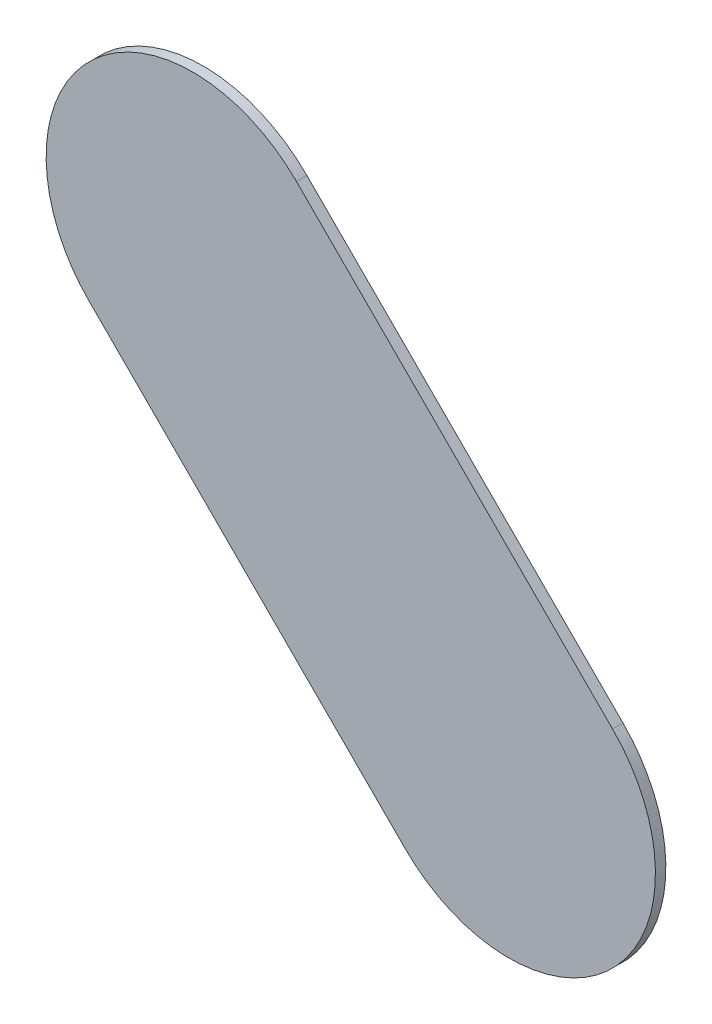
ISO-10303-21;
HEADER;
FILE_DESCRIPTION(('STEP AP214'),'2;1');
FILE_NAME('part.step','',(''),(''),'','','');
FILE_SCHEMA(('AUTOMOTIVE_DESIGN { 1 0 10303 214 1 1 1 1 }'));
ENDSEC;
DATA;
#1=APPLICATION_CONTEXT('core data for automotive mechanical design processes');
#2=APPLICATION_PROTOCOL_DEFINITION('international standard','automotive_design',2000,#1);
#3=PRODUCT_CONTEXT('',#1,'mechanical');
#4=PRODUCT('Part','Part','',(#3));
#5=PRODUCT_RELATED_PRODUCT_CATEGORY('part','',(#4));
#6=PRODUCT_DEFINITION_FORMATION('','',#4);
#7=PRODUCT_DEFINITION_CONTEXT('part definition',#1,'design');
#8=PRODUCT_DEFINITION('design','',#6,#7);
#9=PRODUCT_DEFINITION_SHAPE('','',#8);
#10=(LENGTH_UNIT() NAMED_UNIT(*) SI_UNIT(.MILLI.,.METRE.));
#11=(NAMED_UNIT(*) PLANE_ANGLE_UNIT() SI_UNIT($,.RADIAN.));
#12=(NAMED_UNIT(*) SI_UNIT($,.STERADIAN.) SOLID_ANGLE_UNIT());
#13=UNCERTAINTY_MEASURE_WITH_UNIT(LENGTH_MEASURE(1.E-05),#10,'distance_accuracy_value','');
#14=(GEOMETRIC_REPRESENTATION_CONTEXT(3) GLOBAL_UNCERTAINTY_ASSIGNED_CONTEXT((#13)) GLOBAL_UNIT_ASSIGNED_CONTEXT((#10,
#11,#12)) REPRESENTATION_CONTEXT('',''));
#15=CARTESIAN_POINT('',(0.,0.,0.));
#16=DIRECTION('',(0.,0.,1.));
#17=DIRECTION('',(1.,0.,0.));
#18=AXIS2_PLACEMENT_3D('',#15,#16,#17);
#19=CARTESIAN_POINT('',(95.92855084,119.12555804,0.));
#20=DIRECTION('',(0.707106781186548,0.707106781186548,0.));
#21=DIRECTION('',(0.707106781186548,-0.707106781186548,0.));
#22=AXIS2_PLACEMENT_3D('',#19,#20,#21);
#23=PLANE('',#22);
#24=DIRECTION('',(0.707106781186548,-0.707106781186548,0.));
#25=VECTOR('',#24,1.);
#26=CARTESIAN_POINT('',(95.92855084,119.12555804,0.03556));
#27=LINE('',#26,#25);
#28=CARTESIAN_POINT('',(95.92855084,119.12555804,0.03556));
#29=VERTEX_POINT('',#28);
#30=CARTESIAN_POINT('',(97.00642524,118.04768364,0.03556));
#31=VERTEX_POINT('',#30);
#32=EDGE_CURVE('E11',#29,#31,#27,.T.);
#33=ORIENTED_EDGE('',*,*,#32,.F.);
#34=DIRECTION('',(0.,0.,1.));
#35=VECTOR('',#34,1.);
#36=CARTESIAN_POINT('',(95.92855084,119.12555804,0.));
#37=LINE('',#36,#35);
#38=CARTESIAN_POINT('',(95.92855084,119.12555804,0.));
#39=VERTEX_POINT('',#38);
#40=EDGE_CURVE('E24',#39,#29,#37,.T.);
#41=ORIENTED_EDGE('',*,*,#40,.F.);
#42=DIRECTION('',(0.707106781186548,-0.707106781186548,0.));
#43=VECTOR('',#42,1.);
#44=CARTESIAN_POINT('',(95.92855084,119.12555804,0.));
#45=LINE('',#44,#43);
#46=CARTESIAN_POINT('',(97.00642524,118.04768364,0.));
#47=VERTEX_POINT('',#46);
#48=EDGE_CURVE('E75',#39,#47,#45,.T.);
#49=ORIENTED_EDGE('',*,*,#48,.T.);
#50=DIRECTION('',(0.,0.,1.));
#51=VECTOR('',#50,1.);
#52=CARTESIAN_POINT('',(97.00642524,118.04768364,0.));
#53=LINE('',#52,#51);
#54=EDGE_CURVE('E37',#47,#31,#53,.T.);
#55=ORIENTED_EDGE('',*,*,#54,.T.);
#56=EDGE_LOOP('',(#33,#41,#49,#55));
#57=FACE_BOUND('',#56,.T.);
#58=ADVANCED_FACE('F17',(#57),#23,.F.);
#59=CARTESIAN_POINT('',(97.359978,118.4012364,0.));
#60=DIRECTION('',(0.,0.,-1.));
#61=DIRECTION('',(-0.707106781186548,-0.707106781186548,0.));
#62=AXIS2_PLACEMENT_3D('',#59,#60,#61);
#63=CYLINDRICAL_SURFACE('',#62,0.499999108206442);
#64=CARTESIAN_POINT('',(97.359978,118.4012364,0.03556));
#65=DIRECTION('',(0.,0.,1.));
#66=DIRECTION('',(-0.707106781186548,-0.707106781186548,0.));
#67=AXIS2_PLACEMENT_3D('',#64,#65,#66);
#68=CIRCLE('',#67,0.499999108206442);
#69=CARTESIAN_POINT('',(97.71353076,118.75478916,0.03556));
#70=VERTEX_POINT('',#69);
#71=EDGE_CURVE('E83',#31,#70,#68,.T.);
#72=ORIENTED_EDGE('',*,*,#71,.F.);
#73=ORIENTED_EDGE('',*,*,#54,.F.);
#74=CARTESIAN_POINT('',(97.359978,118.4012364,0.));
#75=DIRECTION('',(0.,0.,1.));
#76=DIRECTION('',(-0.707106781186548,-0.707106781186548,0.));
#77=AXIS2_PLACEMENT_3D('',#74,#75,#76);
#78=CIRCLE('',#77,0.499999108206442);
#79=CARTESIAN_POINT('',(97.71353076,118.75478916,0.));
#80=VERTEX_POINT('',#79);
#81=EDGE_CURVE('E81',#47,#80,#78,.T.);
#82=ORIENTED_EDGE('',*,*,#81,.T.);
#83=DIRECTION('',(0.,0.,1.));
#84=VECTOR('',#83,1.);
#85=CARTESIAN_POINT('',(97.71353076,118.75478916,0.));
#86=LINE('',#85,#84);
#87=EDGE_CURVE('E67',#80,#70,#86,.T.);
#88=ORIENTED_EDGE('',*,*,#87,.T.);
#89=EDGE_LOOP('',(#72,#73,#82,#88));
#90=FACE_BOUND('',#89,.T.);
#91=ADVANCED_FACE('F89',(#90),#63,.T.);
#92=CARTESIAN_POINT('',(97.71353076,118.75478916,0.));
#93=DIRECTION('',(-0.707106781186543,-0.707106781186552,0.));
#94=DIRECTION('',(-0.707106781186552,0.707106781186543,0.));
#95=AXIS2_PLACEMENT_3D('',#92,#93,#94);
#96=PLANE('',#95);
#97=DIRECTION('',(-0.707106781186552,0.707106781186543,0.));
#98=VECTOR('',#97,1.);
#99=CARTESIAN_POINT('',(97.71353076,118.75478916,0.03556));
#100=LINE('',#99,#98);
#101=CARTESIAN_POINT('',(96.63565636,119.83266356,0.03556));
#102=VERTEX_POINT('',#101);
#103=EDGE_CURVE('E71',#70,#102,#100,.T.);
#104=ORIENTED_EDGE('',*,*,#103,.F.);
#105=ORIENTED_EDGE('',*,*,#87,.F.);
#106=DIRECTION('',(-0.707106781186552,0.707106781186543,0.));
#107=VECTOR('',#106,1.);
#108=CARTESIAN_POINT('',(97.71353076,118.75478916,0.));
#109=LINE('',#108,#107);
#110=CARTESIAN_POINT('',(96.63565636,119.83266356,0.));
#111=VERTEX_POINT('',#110);
#112=EDGE_CURVE('E63',#80,#111,#109,.T.);
#113=ORIENTED_EDGE('',*,*,#112,.T.);
#114=DIRECTION('',(0.,0.,1.));
#115=VECTOR('',#114,1.);
#116=CARTESIAN_POINT('',(96.63565636,119.83266356,0.));
#117=LINE('',#116,#115);
#118=EDGE_CURVE('E53',#111,#102,#117,.T.);
#119=ORIENTED_EDGE('',*,*,#118,.T.);
#120=EDGE_LOOP('',(#104,#105,#113,#119));
#121=FACE_BOUND('',#120,.T.);
#122=ADVANCED_FACE('F66',(#121),#96,.F.);
#123=CARTESIAN_POINT('',(96.2821036,119.4791108,0.));
#124=DIRECTION('',(0.,0.,-1.));
#125=DIRECTION('',(0.707106781186548,0.707106781186548,0.));
#126=AXIS2_PLACEMENT_3D('',#123,#124,#125);
#127=CYLINDRICAL_SURFACE('',#126,0.499999108206439);
#128=CARTESIAN_POINT('',(96.2821036,119.4791108,0.03556));
#129=DIRECTION('',(0.,0.,1.));
#130=DIRECTION('',(0.707106781186548,0.707106781186548,0.));
#131=AXIS2_PLACEMENT_3D('',#128,#129,#130);
#132=CIRCLE('',#131,0.499999108206439);
#133=EDGE_CURVE('E59',#102,#29,#132,.T.);
#134=ORIENTED_EDGE('',*,*,#133,.F.);
#135=ORIENTED_EDGE('',*,*,#118,.F.);
#136=CARTESIAN_POINT('',(96.2821036,119.4791108,0.));
#137=DIRECTION('',(0.,0.,1.));
#138=DIRECTION('',(0.707106781186548,0.707106781186548,0.));
#139=AXIS2_PLACEMENT_3D('',#136,#137,#138);
#140=CIRCLE('',#139,0.499999108206439);
#141=EDGE_CURVE('E57',#111,#39,#140,.T.);
#142=ORIENTED_EDGE('',*,*,#141,.T.);
#143=ORIENTED_EDGE('',*,*,#40,.T.);
#144=EDGE_LOOP('',(#134,#135,#142,#143));
#145=FACE_BOUND('',#144,.T.);
#146=ADVANCED_FACE('F55',(#145),#127,.T.);
#147=CARTESIAN_POINT('',(95.92855084,119.12555804,0.));
#148=DIRECTION('',(0.,0.,-1.));
#149=DIRECTION('',(-1.,0.,0.));
#150=AXIS2_PLACEMENT_3D('',#147,#148,#149);
#151=PLANE('',#150);
#152=ORIENTED_EDGE('',*,*,#141,.F.);
#153=ORIENTED_EDGE('',*,*,#112,.F.);
#154=ORIENTED_EDGE('',*,*,#81,.F.);
#155=ORIENTED_EDGE('',*,*,#48,.F.);
#156=EDGE_LOOP('',(#152,#153,#154,#155));
#157=FACE_BOUND('',#156,.T.);
#158=ADVANCED_FACE('F74',(#157),#151,.T.);
#159=CARTESIAN_POINT('',(95.92855084,119.12555804,0.03556));
#160=DIRECTION('',(0.,0.,-1.));
#161=DIRECTION('',(-1.,0.,0.));
#162=AXIS2_PLACEMENT_3D('',#159,#160,#161);
#163=PLANE('',#162);
#164=ORIENTED_EDGE('',*,*,#32,.T.);
#165=ORIENTED_EDGE('',*,*,#71,.T.);
#166=ORIENTED_EDGE('',*,*,#103,.T.);
#167=ORIENTED_EDGE('',*,*,#133,.T.);
#168=EDGE_LOOP('',(#164,#165,#166,#167));
#169=FACE_BOUND('',#168,.T.);
#170=ADVANCED_FACE('F91',(#169),#163,.F.);
#171=CLOSED_SHELL('',(#58,#91,#122,#146,#158,#170));
#172=MANIFOLD_SOLID_BREP('B1',#171);
#173=ADVANCED_BREP_SHAPE_REPRESENTATION('',(#18,#172),#14);
#174=SHAPE_DEFINITION_REPRESENTATION(#9,#173);
ENDSEC;
END-ISO-10303-21;
